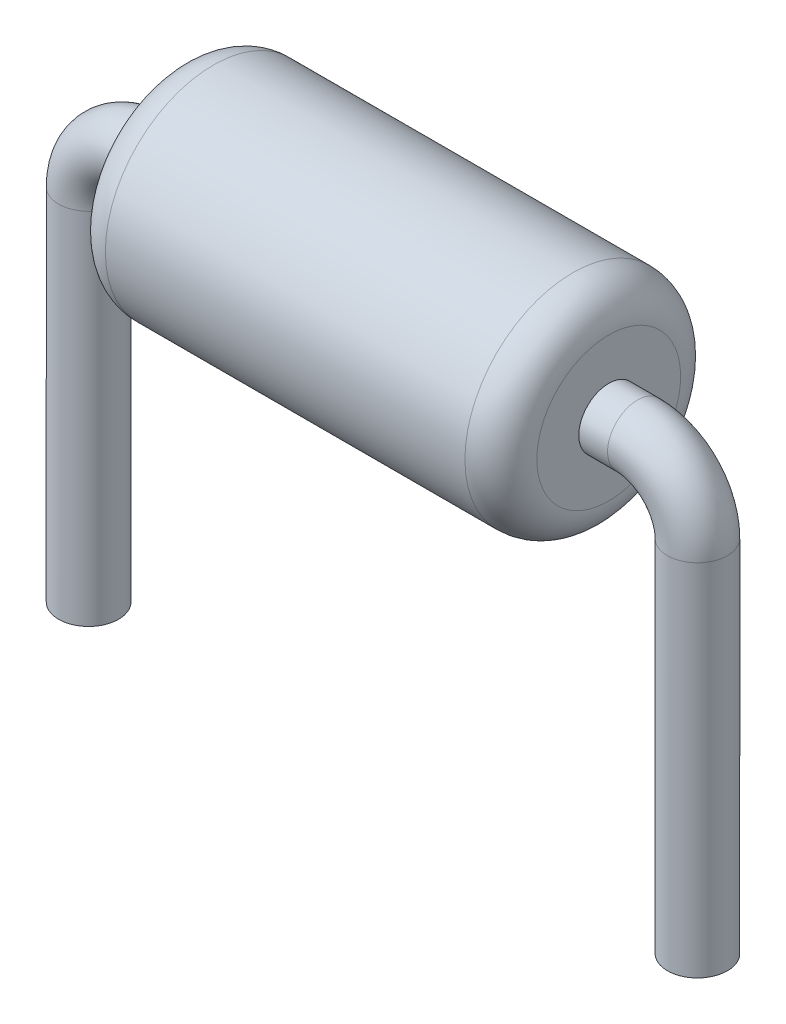
ISO-10303-21;
HEADER;
FILE_DESCRIPTION(('STEP AP214'),'2;1');
FILE_NAME('part.step','',(''),(''),'','','');
FILE_SCHEMA(('AUTOMOTIVE_DESIGN { 1 0 10303 214 1 1 1 1 }'));
ENDSEC;
DATA;
#1=APPLICATION_CONTEXT('core data for automotive mechanical design processes');
#2=APPLICATION_PROTOCOL_DEFINITION('international standard','automotive_design',2000,#1);
#3=PRODUCT_CONTEXT('',#1,'mechanical');
#4=PRODUCT('Part','Part','',(#3));
#5=PRODUCT_RELATED_PRODUCT_CATEGORY('part','',(#4));
#6=PRODUCT_DEFINITION_FORMATION('','',#4);
#7=PRODUCT_DEFINITION_CONTEXT('part definition',#1,'design');
#8=PRODUCT_DEFINITION('design','',#6,#7);
#9=PRODUCT_DEFINITION_SHAPE('','',#8);
#10=(LENGTH_UNIT() NAMED_UNIT(*) SI_UNIT(.MILLI.,.METRE.));
#11=(NAMED_UNIT(*) PLANE_ANGLE_UNIT() SI_UNIT($,.RADIAN.));
#12=(NAMED_UNIT(*) SI_UNIT($,.STERADIAN.) SOLID_ANGLE_UNIT());
#13=UNCERTAINTY_MEASURE_WITH_UNIT(LENGTH_MEASURE(1.E-05),#10,'distance_accuracy_value','');
#14=(GEOMETRIC_REPRESENTATION_CONTEXT(3) GLOBAL_UNCERTAINTY_ASSIGNED_CONTEXT((#13)) GLOBAL_UNIT_ASSIGNED_CONTEXT((#10,
#11,#12)) REPRESENTATION_CONTEXT('',''));
#15=CARTESIAN_POINT('',(0.,0.,0.));
#16=DIRECTION('',(0.,0.,1.));
#17=DIRECTION('',(1.,0.,0.));
#18=AXIS2_PLACEMENT_3D('',#15,#16,#17);
#19=CARTESIAN_POINT('',(1.8,0.,0.));
#20=DIRECTION('',(1.,0.,0.));
#21=DIRECTION('',(0.,0.,-1.));
#22=AXIS2_PLACEMENT_3D('',#19,#20,#21);
#23=PLANE('',#22);
#24=CARTESIAN_POINT('',(1.8,0.9,0.));
#25=DIRECTION('',(1.,0.,0.));
#26=DIRECTION('',(0.,0.,-1.));
#27=AXIS2_PLACEMENT_3D('',#24,#25,#26);
#28=CIRCLE('',#27,0.6);
#29=CARTESIAN_POINT('',(1.8,0.9,-0.6));
#30=VERTEX_POINT('',#29);
#31=EDGE_CURVE('E87',#30,#30,#28,.T.);
#32=ORIENTED_EDGE('',*,*,#31,.T.);
#33=EDGE_LOOP('',(#32));
#34=FACE_BOUND('',#33,.T.);
#35=CARTESIAN_POINT('',(1.8,0.9,0.));
#36=DIRECTION('',(1.,0.,0.));
#37=DIRECTION('',(0.,0.,-1.));
#38=AXIS2_PLACEMENT_3D('',#35,#36,#37);
#39=CIRCLE('',#38,0.25);
#40=CARTESIAN_POINT('',(1.8,0.9,-0.25));
#41=VERTEX_POINT('',#40);
#42=EDGE_CURVE('E74',#41,#41,#39,.T.);
#43=ORIENTED_EDGE('',*,*,#42,.F.);
#44=EDGE_LOOP('',(#43));
#45=FACE_BOUND('',#44,.T.);
#46=ADVANCED_FACE('F39',(#34,#45),#23,.T.);
#47=CARTESIAN_POINT('',(0.,0.9,0.));
#48=DIRECTION('',(-1.,0.,0.));
#49=DIRECTION('',(0.,0.,1.));
#50=AXIS2_PLACEMENT_3D('',#47,#48,#49);
#51=CYLINDRICAL_SURFACE('',#50,0.9);
#52=CARTESIAN_POINT('',(-1.5,0.9,0.));
#53=DIRECTION('',(-1.,0.,0.));
#54=DIRECTION('',(0.,0.,1.));
#55=AXIS2_PLACEMENT_3D('',#52,#53,#54);
#56=CIRCLE('',#55,0.9);
#57=CARTESIAN_POINT('',(-1.5,0.9,0.9));
#58=VERTEX_POINT('',#57);
#59=EDGE_CURVE('E11',#58,#58,#56,.F.);
#60=ORIENTED_EDGE('',*,*,#59,.T.);
#61=EDGE_LOOP('',(#60));
#62=FACE_BOUND('',#61,.T.);
#63=CARTESIAN_POINT('',(1.5,0.9,0.));
#64=DIRECTION('',(1.,0.,0.));
#65=DIRECTION('',(0.,0.,-1.));
#66=AXIS2_PLACEMENT_3D('',#63,#64,#65);
#67=CIRCLE('',#66,0.9);
#68=CARTESIAN_POINT('',(1.5,0.9,-0.9));
#69=VERTEX_POINT('',#68);
#70=EDGE_CURVE('E77',#69,#69,#67,.F.);
#71=ORIENTED_EDGE('',*,*,#70,.T.);
#72=EDGE_LOOP('',(#71));
#73=FACE_BOUND('',#72,.T.);
#74=ADVANCED_FACE('F119',(#62,#73),#51,.T.);
#75=CARTESIAN_POINT('',(2.54,-2.6,0.));
#76=DIRECTION('',(0.,-1.,0.));
#77=DIRECTION('',(0.,0.,-1.));
#78=AXIS2_PLACEMENT_3D('',#75,#76,#77);
#79=PLANE('',#78);
#80=CARTESIAN_POINT('',(2.54,-2.6,0.));
#81=DIRECTION('',(0.,-1.,0.));
#82=DIRECTION('',(0.,0.,-1.));
#83=AXIS2_PLACEMENT_3D('',#80,#81,#82);
#84=CIRCLE('',#83,0.25);
#85=CARTESIAN_POINT('',(2.54,-2.6,-0.25));
#86=VERTEX_POINT('',#85);
#87=EDGE_CURVE('E53',#86,#86,#84,.T.);
#88=ORIENTED_EDGE('',*,*,#87,.T.);
#89=EDGE_LOOP('',(#88));
#90=FACE_BOUND('',#89,.T.);
#91=ADVANCED_FACE('F125',(#90),#79,.T.);
#92=CARTESIAN_POINT('',(1.8,0.9,0.));
#93=DIRECTION('',(1.,0.,0.));
#94=DIRECTION('',(0.,0.,-1.));
#95=AXIS2_PLACEMENT_3D('',#92,#93,#94);
#96=CYLINDRICAL_SURFACE('',#95,0.25);
#97=CARTESIAN_POINT('',(2.04,0.9,0.));
#98=DIRECTION('',(1.,0.,0.));
#99=DIRECTION('',(0.,0.,-1.));
#100=AXIS2_PLACEMENT_3D('',#97,#98,#99);
#101=CIRCLE('',#100,0.25);
#102=CARTESIAN_POINT('',(2.04,1.15,0.));
#103=VERTEX_POINT('',#102);
#104=EDGE_CURVE('E61',#103,#103,#101,.T.);
#105=ORIENTED_EDGE('',*,*,#104,.F.);
#106=EDGE_LOOP('',(#105));
#107=FACE_BOUND('',#106,.T.);
#108=ORIENTED_EDGE('',*,*,#42,.T.);
#109=EDGE_LOOP('',(#108));
#110=FACE_BOUND('',#109,.T.);
#111=ADVANCED_FACE('F145',(#107,#110),#96,.T.);
#112=CARTESIAN_POINT('',(2.04,0.4,0.));
#113=DIRECTION('',(0.,0.,-1.));
#114=DIRECTION('',(-1.,0.,0.));
#115=AXIS2_PLACEMENT_3D('',#112,#113,#114);
#116=TOROIDAL_SURFACE('',#115,0.5,0.25);
#117=CARTESIAN_POINT('',(2.54,0.4,0.));
#118=DIRECTION('',(0.,-1.,0.));
#119=DIRECTION('',(0.,0.,-1.));
#120=AXIS2_PLACEMENT_3D('',#117,#118,#119);
#121=CIRCLE('',#120,0.25);
#122=CARTESIAN_POINT('',(2.79,0.4,0.));
#123=VERTEX_POINT('',#122);
#124=EDGE_CURVE('E67',#123,#123,#121,.T.);
#125=CARTESIAN_POINT('',(2.04,0.4,0.));
#126=DIRECTION('',(0.,0.,-1.));
#127=DIRECTION('',(-1.,0.,0.));
#128=AXIS2_PLACEMENT_3D('',#125,#126,#127);
#129=CIRCLE('',#128,0.75);
#130=EDGE_CURVE('',#103,#123,#129,.T.);
#131=ORIENTED_EDGE('',*,*,#104,.T.);
#132=ORIENTED_EDGE('',*,*,#124,.F.);
#133=ORIENTED_EDGE('',*,*,#130,.T.);
#134=ORIENTED_EDGE('',*,*,#130,.F.);
#135=EDGE_LOOP('',(#131,#133,#132,#134));
#136=FACE_BOUND('',#135,.T.);
#137=ADVANCED_FACE('F139',(#136),#116,.T.);
#138=CARTESIAN_POINT('',(2.54,0.4,0.));
#139=DIRECTION('',(0.,-1.,0.));
#140=DIRECTION('',(1.,0.,0.));
#141=AXIS2_PLACEMENT_3D('',#138,#139,#140);
#142=CYLINDRICAL_SURFACE('',#141,0.25);
#143=ORIENTED_EDGE('',*,*,#87,.F.);
#144=EDGE_LOOP('',(#143));
#145=FACE_BOUND('',#144,.T.);
#146=ORIENTED_EDGE('',*,*,#124,.T.);
#147=EDGE_LOOP('',(#146));
#148=FACE_BOUND('',#147,.T.);
#149=ADVANCED_FACE('F128',(#145,#148),#142,.T.);
#150=CARTESIAN_POINT('',(1.5,0.9,0.));
#151=DIRECTION('',(1.,0.,0.));
#152=DIRECTION('',(0.,0.,-1.));
#153=AXIS2_PLACEMENT_3D('',#150,#151,#152);
#154=TOROIDAL_SURFACE('',#153,0.6,0.3);
#155=ORIENTED_EDGE('',*,*,#31,.F.);
#156=EDGE_LOOP('',(#155));
#157=FACE_BOUND('',#156,.T.);
#158=ORIENTED_EDGE('',*,*,#70,.F.);
#159=EDGE_LOOP('',(#158));
#160=FACE_BOUND('',#159,.T.);
#161=ADVANCED_FACE('F131',(#157,#160),#154,.T.);
#162=CARTESIAN_POINT('',(-1.8,0.,0.));
#163=DIRECTION('',(-1.,0.,0.));
#164=DIRECTION('',(0.,0.,-1.));
#165=AXIS2_PLACEMENT_3D('',#162,#163,#164);
#166=PLANE('',#165);
#167=CARTESIAN_POINT('',(-1.8,0.9,0.));
#168=DIRECTION('',(-1.,0.,0.));
#169=DIRECTION('',(0.,0.,1.));
#170=AXIS2_PLACEMENT_3D('',#167,#168,#169);
#171=CIRCLE('',#170,0.6);
#172=CARTESIAN_POINT('',(-1.8,0.9,0.6));
#173=VERTEX_POINT('',#172);
#174=EDGE_CURVE('E48',#173,#173,#171,.T.);
#175=ORIENTED_EDGE('',*,*,#174,.T.);
#176=EDGE_LOOP('',(#175));
#177=FACE_BOUND('',#176,.T.);
#178=CARTESIAN_POINT('',(-1.8,0.9,0.));
#179=DIRECTION('',(1.,0.,0.));
#180=DIRECTION('',(0.,0.,-1.));
#181=AXIS2_PLACEMENT_3D('',#178,#179,#180);
#182=CIRCLE('',#181,0.25);
#183=CARTESIAN_POINT('',(-1.8,0.9,-0.25));
#184=VERTEX_POINT('',#183);
#185=EDGE_CURVE('E90',#184,#184,#182,.F.);
#186=ORIENTED_EDGE('',*,*,#185,.F.);
#187=EDGE_LOOP('',(#186));
#188=FACE_BOUND('',#187,.T.);
#189=ADVANCED_FACE('F116',(#177,#188),#166,.T.);
#190=CARTESIAN_POINT('',(-2.54,-2.6,0.));
#191=DIRECTION('',(0.,-1.,0.));
#192=DIRECTION('',(0.,0.,-1.));
#193=AXIS2_PLACEMENT_3D('',#190,#191,#192);
#194=PLANE('',#193);
#195=CARTESIAN_POINT('',(-2.54,-2.6,0.));
#196=DIRECTION('',(0.,1.,0.));
#197=DIRECTION('',(0.,0.,-1.));
#198=AXIS2_PLACEMENT_3D('',#195,#196,#197);
#199=CIRCLE('',#198,0.25);
#200=CARTESIAN_POINT('',(-2.54,-2.6,-0.25));
#201=VERTEX_POINT('',#200);
#202=EDGE_CURVE('E57',#201,#201,#199,.F.);
#203=ORIENTED_EDGE('',*,*,#202,.T.);
#204=EDGE_LOOP('',(#203));
#205=FACE_BOUND('',#204,.T.);
#206=ADVANCED_FACE('F58',(#205),#194,.T.);
#207=CARTESIAN_POINT('',(-1.8,0.9,0.));
#208=DIRECTION('',(-1.,0.,0.));
#209=DIRECTION('',(0.,0.,1.));
#210=AXIS2_PLACEMENT_3D('',#207,#208,#209);
#211=CYLINDRICAL_SURFACE('',#210,0.25);
#212=CARTESIAN_POINT('',(-2.04,0.9,0.));
#213=DIRECTION('',(1.,0.,0.));
#214=DIRECTION('',(0.,0.,-1.));
#215=AXIS2_PLACEMENT_3D('',#212,#213,#214);
#216=CIRCLE('',#215,0.25);
#217=CARTESIAN_POINT('',(-2.04,1.15,0.));
#218=VERTEX_POINT('',#217);
#219=EDGE_CURVE('E70',#218,#218,#216,.F.);
#220=ORIENTED_EDGE('',*,*,#219,.F.);
#221=EDGE_LOOP('',(#220));
#222=FACE_BOUND('',#221,.T.);
#223=ORIENTED_EDGE('',*,*,#185,.T.);
#224=EDGE_LOOP('',(#223));
#225=FACE_BOUND('',#224,.T.);
#226=ADVANCED_FACE('F106',(#222,#225),#211,.T.);
#227=CARTESIAN_POINT('',(-2.04,0.4,0.));
#228=DIRECTION('',(0.,0.,1.));
#229=DIRECTION('',(1.,0.,0.));
#230=AXIS2_PLACEMENT_3D('',#227,#228,#229);
#231=TOROIDAL_SURFACE('',#230,0.5,0.25);
#232=CARTESIAN_POINT('',(-2.54,0.4,0.));
#233=DIRECTION('',(0.,1.,0.));
#234=DIRECTION('',(0.,0.,-1.));
#235=AXIS2_PLACEMENT_3D('',#232,#233,#234);
#236=CIRCLE('',#235,0.25);
#237=CARTESIAN_POINT('',(-2.79,0.4,0.));
#238=VERTEX_POINT('',#237);
#239=EDGE_CURVE('E62',#238,#238,#236,.F.);
#240=CARTESIAN_POINT('',(-2.04,0.4,0.));
#241=DIRECTION('',(0.,0.,1.));
#242=DIRECTION('',(1.,0.,0.));
#243=AXIS2_PLACEMENT_3D('',#240,#241,#242);
#244=CIRCLE('',#243,0.75);
#245=EDGE_CURVE('',#218,#238,#244,.T.);
#246=ORIENTED_EDGE('',*,*,#219,.T.);
#247=ORIENTED_EDGE('',*,*,#239,.F.);
#248=ORIENTED_EDGE('',*,*,#245,.T.);
#249=ORIENTED_EDGE('',*,*,#245,.F.);
#250=EDGE_LOOP('',(#246,#248,#247,#249));
#251=FACE_BOUND('',#250,.T.);
#252=ADVANCED_FACE('F104',(#251),#231,.T.);
#253=CARTESIAN_POINT('',(-2.54,0.4,0.));
#254=DIRECTION('',(0.,-1.,0.));
#255=DIRECTION('',(1.,0.,0.));
#256=AXIS2_PLACEMENT_3D('',#253,#254,#255);
#257=CYLINDRICAL_SURFACE('',#256,0.25);
#258=ORIENTED_EDGE('',*,*,#202,.F.);
#259=EDGE_LOOP('',(#258));
#260=FACE_BOUND('',#259,.T.);
#261=ORIENTED_EDGE('',*,*,#239,.T.);
#262=EDGE_LOOP('',(#261));
#263=FACE_BOUND('',#262,.T.);
#264=ADVANCED_FACE('F113',(#260,#263),#257,.T.);
#265=CARTESIAN_POINT('',(-1.5,0.9,0.));
#266=DIRECTION('',(-1.,0.,0.));
#267=DIRECTION('',(0.,0.,1.));
#268=AXIS2_PLACEMENT_3D('',#265,#266,#267);
#269=TOROIDAL_SURFACE('',#268,0.6,0.3);
#270=ORIENTED_EDGE('',*,*,#59,.F.);
#271=EDGE_LOOP('',(#270));
#272=FACE_BOUND('',#271,.T.);
#273=ORIENTED_EDGE('',*,*,#174,.F.);
#274=EDGE_LOOP('',(#273));
#275=FACE_BOUND('',#274,.T.);
#276=ADVANCED_FACE('F41',(#272,#275),#269,.T.);
#277=CLOSED_SHELL('',(#46,#74,#91,#111,#137,#149,#161,#189,#206,#226,#252,#264,#276));
#278=MANIFOLD_SOLID_BREP('B2',#277);
#279=ADVANCED_BREP_SHAPE_REPRESENTATION('',(#18,#278),#14);
#280=SHAPE_DEFINITION_REPRESENTATION(#9,#279);
ENDSEC;
END-ISO-10303-21;
